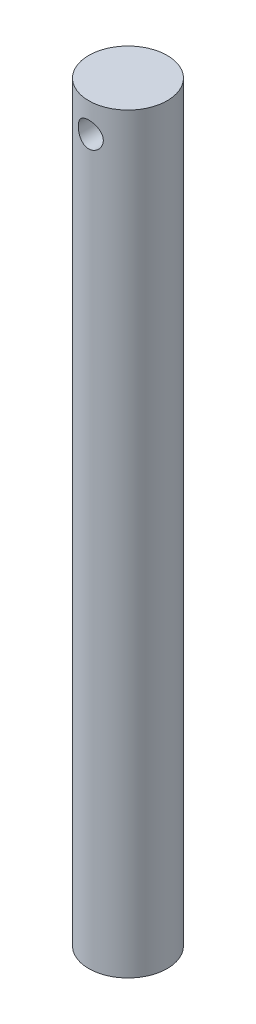
ISO-10303-21;
HEADER;
FILE_DESCRIPTION(('STEP AP214'),'2;1');
FILE_NAME('part.step','',(''),(''),'','','');
FILE_SCHEMA(('AUTOMOTIVE_DESIGN { 1 0 10303 214 1 1 1 1 }'));
ENDSEC;
DATA;
#1=APPLICATION_CONTEXT('core data for automotive mechanical design processes');
#2=APPLICATION_PROTOCOL_DEFINITION('international standard','automotive_design',2000,#1);
#3=PRODUCT_CONTEXT('',#1,'mechanical');
#4=PRODUCT('Part','Part','',(#3));
#5=PRODUCT_RELATED_PRODUCT_CATEGORY('part','',(#4));
#6=PRODUCT_DEFINITION_FORMATION('','',#4);
#7=PRODUCT_DEFINITION_CONTEXT('part definition',#1,'design');
#8=PRODUCT_DEFINITION('design','',#6,#7);
#9=PRODUCT_DEFINITION_SHAPE('','',#8);
#10=(LENGTH_UNIT() NAMED_UNIT(*) SI_UNIT(.MILLI.,.METRE.));
#11=(NAMED_UNIT(*) PLANE_ANGLE_UNIT() SI_UNIT($,.RADIAN.));
#12=(NAMED_UNIT(*) SI_UNIT($,.STERADIAN.) SOLID_ANGLE_UNIT());
#13=UNCERTAINTY_MEASURE_WITH_UNIT(LENGTH_MEASURE(1.E-05),#10,'distance_accuracy_value','');
#14=(GEOMETRIC_REPRESENTATION_CONTEXT(3) GLOBAL_UNCERTAINTY_ASSIGNED_CONTEXT((#13)) GLOBAL_UNIT_ASSIGNED_CONTEXT((#10,
#11,#12)) REPRESENTATION_CONTEXT('',''));
#15=CARTESIAN_POINT('',(0.,0.,0.));
#16=DIRECTION('',(0.,0.,1.));
#17=DIRECTION('',(1.,0.,0.));
#18=AXIS2_PLACEMENT_3D('',#15,#16,#17);
#19=CARTESIAN_POINT('',(0.,180.,0.));
#20=DIRECTION('',(0.,-1.,0.));
#21=DIRECTION('',(0.,0.,-1.));
#22=AXIS2_PLACEMENT_3D('',#19,#20,#21);
#23=CYLINDRICAL_SURFACE('',#22,9.4);
#24=CARTESIAN_POINT('',(0.,176.,-9.4));
#25=CARTESIAN_POINT('',(-0.164077470489831,175.999999470935,-9.39999954806121));
#26=CARTESIAN_POINT('',(-0.328161250908178,175.986495103096,-9.39566376836351));
#27=CARTESIAN_POINT('',(-0.651519409291409,175.932983405037,-9.37879296985486));
#28=CARTESIAN_POINT('',(-0.810792879393145,175.892971104183,-9.3662564132809));
#29=CARTESIAN_POINT('',(-1.11982123641581,175.787938081643,-9.33435130741574));
#30=CARTESIAN_POINT('',(-1.26959079188904,175.722957047876,-9.31499360439881));
#31=CARTESIAN_POINT('',(-1.5561074913261,175.570003297434,-9.2714377159008));
#32=CARTESIAN_POINT('',(-1.69285241032534,175.482026662056,-9.24723870557312));
#33=CARTESIAN_POINT('',(-1.95382349376147,175.282611489651,-9.19569409293265));
#34=CARTESIAN_POINT('',(-2.07757366671397,175.170568392752,-9.16827776632944));
#35=CARTESIAN_POINT('',(-2.3048844016925,174.927487400136,-9.11379162666395));
#36=CARTESIAN_POINT('',(-2.4084409975412,174.796445781756,-9.08672188264675));
#37=CARTESIAN_POINT('',(-2.59504820345534,174.514915563449,-9.03522898873549));
#38=CARTESIAN_POINT('',(-2.67749666606587,174.364010420405,-9.01089279091667));
#39=CARTESIAN_POINT('',(-2.8156454291163,174.04957403711,-8.96868979451483));
#40=CARTESIAN_POINT('',(-2.87135312129096,173.886046300545,-8.95082120847853));
#41=CARTESIAN_POINT('',(-2.95268350808569,173.556391414685,-8.92431789620066));
#42=CARTESIAN_POINT('',(-2.97919203574533,173.39050523012,-8.91541203755513));
#43=CARTESIAN_POINT('',(-3.00413969308351,173.056419184158,-8.90703845090929));
#44=CARTESIAN_POINT('',(-3.00258665618365,172.888219981544,-8.90756808897741));
#45=CARTESIAN_POINT('',(-2.97214652057047,172.561679857283,-8.91776686392915));
#46=CARTESIAN_POINT('',(-2.94439468902201,172.403219234192,-8.92705639169457));
#47=CARTESIAN_POINT('',(-2.86418895317406,172.09333270438,-8.95311016597804));
#48=CARTESIAN_POINT('',(-2.81173232041958,171.941907576706,-8.9698752381015));
#49=CARTESIAN_POINT('',(-2.68282284249056,171.647725321901,-9.00927557068709));
#50=CARTESIAN_POINT('',(-2.60601985578356,171.505133465873,-9.03199559079645));
#51=CARTESIAN_POINT('',(-2.43084093937358,171.23449334413,-9.08070805396861));
#52=CARTESIAN_POINT('',(-2.33245920532367,171.106449005564,-9.10670137669616));
#53=CARTESIAN_POINT('',(-2.11138169318756,170.862132377468,-9.16054536353899));
#54=CARTESIAN_POINT('',(-1.98775149936678,170.746710517761,-9.18842554343806));
#55=CARTESIAN_POINT('',(-1.72254378637404,170.538026086335,-9.24181343737215));
#56=CARTESIAN_POINT('',(-1.58096482223082,170.444765300439,-9.26732096010873));
#57=CARTESIAN_POINT('',(-1.2821881876731,170.282440689262,-9.31337751751181));
#58=CARTESIAN_POINT('',(-1.12486889739939,170.213587502037,-9.3338829331381));
#59=CARTESIAN_POINT('',(-0.800072736095409,170.103578722303,-9.3673095353702));
#60=CARTESIAN_POINT('',(-0.632599106047738,170.0624143425,-9.3802331279695));
#61=CARTESIAN_POINT('',(-0.299460884184892,170.010418427804,-9.39664920554624));
#62=CARTESIAN_POINT('',(-0.133993238208741,169.998436299098,-9.40049923314968));
#63=CARTESIAN_POINT('',(0.196610506282663,170.00189045309,-9.39939648681926));
#64=CARTESIAN_POINT('',(0.361746651678781,170.017322538365,-9.39444506048672));
#65=CARTESIAN_POINT('',(0.68250956521564,170.07424731288,-9.37653108344297));
#66=CARTESIAN_POINT('',(0.838272058507402,170.115048615775,-9.36378120906926));
#67=CARTESIAN_POINT('',(1.14069131775732,170.22070351201,-9.33177184409746));
#68=CARTESIAN_POINT('',(1.28734694292983,170.285560111606,-9.31251153989984));
#69=CARTESIAN_POINT('',(1.57147275037586,170.439293817218,-9.26885448794427));
#70=CARTESIAN_POINT('',(1.70862137180437,170.528731233799,-9.24434129984636));
#71=CARTESIAN_POINT('',(1.96634610150375,170.728420035918,-9.19297450501304));
#72=CARTESIAN_POINT('',(2.08691751685651,170.838677294561,-9.16612023903244));
#73=CARTESIAN_POINT('',(2.31325606231478,171.082288823271,-9.11169408137757));
#74=CARTESIAN_POINT('',(2.41820263968151,171.216410896706,-9.08413856796694));
#75=CARTESIAN_POINT('',(2.60418162850969,171.500959629424,-9.03258454260389));
#76=CARTESIAN_POINT('',(2.68521425910941,171.651386139282,-9.00858599805776));
#77=CARTESIAN_POINT('',(2.82059617306601,171.964069481191,-8.96712125723658));
#78=CARTESIAN_POINT('',(2.87503508785583,172.126284427551,-8.94963316622974));
#79=CARTESIAN_POINT('',(2.95561446162164,172.458255982248,-8.92334995921455));
#80=CARTESIAN_POINT('',(2.98176629350441,172.628009531069,-8.91455134969784));
#81=CARTESIAN_POINT('',(3.00418975128659,172.96163158371,-8.90701792548483));
#82=CARTESIAN_POINT('',(3.00181231867922,173.125400100078,-8.90782808627987));
#83=CARTESIAN_POINT('',(2.97052587445334,173.450079271523,-8.91830936711926));
#84=CARTESIAN_POINT('',(2.94161820228853,173.610990070461,-8.92798003981572));
#85=CARTESIAN_POINT('',(2.85901298731115,173.922856096908,-8.95476804961276));
#86=CARTESIAN_POINT('',(2.80571788418963,174.073929120955,-8.9717642465573));
#87=CARTESIAN_POINT('',(2.67617011817065,174.365108380821,-9.01125285119482));
#88=CARTESIAN_POINT('',(2.59991264458935,174.505212310825,-9.03374641041511));
#89=CARTESIAN_POINT('',(2.42298978489153,174.776630560067,-9.08283335969191));
#90=CARTESIAN_POINT('',(2.32145982977443,174.907357845687,-9.10955603895614));
#91=CARTESIAN_POINT('',(2.0983765587176,175.150356573113,-9.16351284091298));
#92=CARTESIAN_POINT('',(1.97681779421186,175.262622976237,-9.19074710098313));
#93=CARTESIAN_POINT('',(1.71207232598818,175.469408470947,-9.24378865985534));
#94=CARTESIAN_POINT('',(1.56828303317006,175.563179514515,-9.26951403521373));
#95=CARTESIAN_POINT('',(1.26616384040922,175.725101012932,-9.31558512962654));
#96=CARTESIAN_POINT('',(1.10783907006028,175.793260463237,-9.33593273674646));
#97=CARTESIAN_POINT('',(0.792926630092125,175.897718615548,-9.36773612734605));
#98=CARTESIAN_POINT('',(0.637036509380272,175.935959902683,-9.3797271674068));
#99=CARTESIAN_POINT('',(0.320765593639223,175.987098018458,-9.39585844643191));
#100=CARTESIAN_POINT('',(0.160385811410837,176.000000517161,-9.4000004417704));
#101=CARTESIAN_POINT('',(0.,176.,-9.4));
#102=B_SPLINE_CURVE_WITH_KNOTS('',3,(#24,#25,#26,#27,#28,#29,#30,#31,#32,#33,#34,#35,#36,#37,
#38,#39,#40,#41,#42,#43,#44,#45,#46,#47,#48,#49,#50,#51,#52,#53,#54,#55,#56,#57,#58,#59,#60,#61,
#62,#63,#64,#65,#66,#67,#68,#69,#70,#71,#72,#73,#74,#75,#76,#77,#78,#79,#80,#81,#82,#83,#84,#85,
#86,#87,#88,#89,#90,#91,#92,#93,#94,#95,#96,#97,#98,#99,#100,#101),.UNSPECIFIED.,.T.,.F.,(4,2,2,
2,2,2,2,2,2,2,2,2,2,2,2,2,2,2,2,2,2,2,2,2,2,2,2,2,2,2,2,2,2,2,2,2,2,2,4),(0.,0.491642670836408,
0.983377558144805,1.47433404239505,1.96537424560118,2.47060524027465,2.97593536656139,
3.49438431270147,4.01268986555103,4.51479683249523,5.01676363780371,5.49793119322769,
5.97915190236772,6.46763387747095,6.95624740810529,7.46811817910525,7.98003018461752,
8.49625820647579,9.01232232131036,9.50768387497366,10.0029695897595,10.4853155886975,
10.9677218880557,11.4621960831845,11.9568099743368,12.4719208456453,12.9870269965284,
13.5003848458665,14.0135362213303,14.5024882320929,14.9914155580974,15.4725504438551,
15.9537861989944,16.4545418343841,16.9554339191498,17.4736488247902,17.9916815494037,
18.4723700878433,18.9529510503051),.UNSPECIFIED.);
#103=CARTESIAN_POINT('',(0.,176.,-9.4));
#104=VERTEX_POINT('',#103);
#105=EDGE_CURVE('E12',#104,#104,#102,.T.);
#106=ORIENTED_EDGE('',*,*,#105,.T.);
#107=EDGE_LOOP('',(#106));
#108=FACE_BOUND('',#107,.T.);
#109=CARTESIAN_POINT('',(3.,173.,8.90842298052804));
#110=CARTESIAN_POINT('',(2.99999944551202,172.83616292116,8.90842355580121));
#111=CARTESIAN_POINT('',(2.98653319210237,172.672319522679,8.91299217302225));
#112=CARTESIAN_POINT('',(2.9331866175705,172.349458937418,8.93068786685061));
#113=CARTESIAN_POINT('',(2.89330005397961,172.190442900514,8.94381696607753));
#114=CARTESIAN_POINT('',(2.78863422533186,171.881961991662,8.97699838804047));
#115=CARTESIAN_POINT('',(2.72390047481657,171.732480235475,8.99703804538643));
#116=CARTESIAN_POINT('',(2.57153086098392,171.446454899396,9.04176476866295));
#117=CARTESIAN_POINT('',(2.48389062647002,171.309913795726,9.0664527213663));
#118=CARTESIAN_POINT('',(2.28483177661673,171.048752094704,9.11868670142876));
#119=CARTESIAN_POINT('',(2.17273274483269,170.924663352817,9.14629955266741));
#120=CARTESIAN_POINT('',(1.92939314194433,170.696688087356,9.20070464975101));
#121=CARTESIAN_POINT('',(1.79814978160329,170.592804512733,9.22749677533077));
#122=CARTESIAN_POINT('',(1.51640401733318,170.405820855767,9.27800896684672));
#123=CARTESIAN_POINT('',(1.36551899788323,170.323271484111,9.30164121130606));
#124=CARTESIAN_POINT('',(1.05112328369015,170.184930987532,9.34238839904248));
#125=CARTESIAN_POINT('',(0.887615703138742,170.129133286875,9.35950494370735));
#126=CARTESIAN_POINT('',(0.558187449971977,170.04766450911,9.38481906828492));
#127=CARTESIAN_POINT('',(0.392512772112125,170.021083749528,9.39328534301072));
#128=CARTESIAN_POINT('',(0.0588531833406413,169.995917940162,9.40129549260589));
#129=CARTESIAN_POINT('',(-0.109131171075982,169.997326260822,9.40084148035402));
#130=CARTESIAN_POINT('',(-0.436227852521742,170.027506901312,9.39124773980567));
#131=CARTESIAN_POINT('',(-0.595441888583559,170.055292494636,9.38242122135951));
#132=CARTESIAN_POINT('',(-0.906816016790057,170.135815942711,9.35746194771307));
#133=CARTESIAN_POINT('',(-1.05897564184418,170.18855544714,9.34132870947569));
#134=CARTESIAN_POINT('',(-1.35416091453656,170.318105298444,9.30315508422285));
#135=CARTESIAN_POINT('',(-1.4970480949096,170.395209200038,9.28104315860557));
#136=CARTESIAN_POINT('',(-1.76815810836419,170.571061719259,9.23323318337949));
#137=CARTESIAN_POINT('',(-1.89637709990865,170.669815987367,9.20753419822936));
#138=CARTESIAN_POINT('',(-2.14039093473823,170.891203011327,9.15396174620494));
#139=CARTESIAN_POINT('',(-2.25540566289409,171.014685693227,9.12604231098691));
#140=CARTESIAN_POINT('',(-2.46333347762658,171.279440465901,9.07213069984808));
#141=CARTESIAN_POINT('',(-2.55624372230966,171.420714840522,9.0461387720353));
#142=CARTESIAN_POINT('',(-2.71828571859886,171.719330081143,8.99878685692771));
#143=CARTESIAN_POINT('',(-2.78711606657574,171.876844707006,8.97748673793884));
#144=CARTESIAN_POINT('',(-2.89702409331116,172.202074695677,8.94262907118287));
#145=CARTESIAN_POINT('',(-2.93811225519386,172.369786179188,8.92906859908393));
#146=CARTESIAN_POINT('',(-2.98983863392866,172.703148772708,8.9118786621899));
#147=CARTESIAN_POINT('',(-3.00167617212799,172.868593724021,8.90785832681626));
#148=CARTESIAN_POINT('',(-2.99794170240944,173.199121581842,8.90911631418849));
#149=CARTESIAN_POINT('',(-2.98237415551395,173.364204542894,8.91439312353758));
#150=CARTESIAN_POINT('',(-2.92534514842051,173.68406882467,8.93326373478144));
#151=CARTESIAN_POINT('',(-2.88468996192181,173.839010793548,8.94659830711034));
#152=CARTESIAN_POINT('',(-2.77959284776365,174.139852581124,8.97980401675619));
#153=CARTESIAN_POINT('',(-2.71514693189688,174.285750878975,8.99967624996641));
#154=CARTESIAN_POINT('',(-2.56211955584604,174.569153804304,9.04444917637221));
#155=CARTESIAN_POINT('',(-2.47287905985344,174.706281235913,9.06948150707161));
#156=CARTESIAN_POINT('',(-2.27355798701656,174.964050543009,9.12148700346645));
#157=CARTESIAN_POINT('',(-2.16347176595913,175.084687938367,9.1484606935776));
#158=CARTESIAN_POINT('',(-1.91989028341433,175.31146989744,9.20272945888258));
#159=CARTESIAN_POINT('',(-1.78558498717357,175.416755652654,9.22998746572608));
#160=CARTESIAN_POINT('',(-1.50054964070287,175.603335901117,9.28058570780895));
#161=CARTESIAN_POINT('',(-1.3498202984154,175.684631427881,9.30392611180268));
#162=CARTESIAN_POINT('',(-1.0370957657006,175.820151343734,9.34393256919197));
#163=CARTESIAN_POINT('',(-0.875189665857122,175.874566744164,9.36064554466592));
#164=CARTESIAN_POINT('',(-0.543893019303663,175.95520206318,9.38571955276349));
#165=CARTESIAN_POINT('',(-0.374504944986433,175.98143122431,9.39408332310947));
#166=CARTESIAN_POINT('',(-0.040941919206546,176.004172988792,9.40132720084067));
#167=CARTESIAN_POINT('',(0.123141019697496,176.001923597182,9.40060241486101));
#168=CARTESIAN_POINT('',(0.448484156986928,175.970784721324,9.39070527402717));
#169=CARTESIAN_POINT('',(0.609744552257155,175.941897102815,9.38153351079906));
#170=CARTESIAN_POINT('',(0.922712411678374,175.85910110324,9.35590439957263));
#171=CARTESIAN_POINT('',(1.07451957825294,175.805536400785,9.33954726350454));
#172=CARTESIAN_POINT('',(1.36706115201644,175.675219344721,9.30123285831134));
#173=CARTESIAN_POINT('',(1.5077936174321,175.598462936181,9.27927460996998));
#174=CARTESIAN_POINT('',(1.77954030330891,175.420846456456,9.23108625065706));
#175=CARTESIAN_POINT('',(1.91004370967406,175.319238433266,9.20473376427968));
#176=CARTESIAN_POINT('',(2.15255670550981,175.096107292041,9.1510630826314));
#177=CARTESIAN_POINT('',(2.26456062560843,174.974578091591,9.12374459442112));
#178=CARTESIAN_POINT('',(2.47085907424239,174.7099616361,9.07009544073137));
#179=CARTESIAN_POINT('',(2.56439688931789,174.566268885931,9.04383277786961));
#180=CARTESIAN_POINT('',(2.72590485967991,174.264403723388,8.99647507480559));
#181=CARTESIAN_POINT('',(2.79388424807814,174.106236565693,8.9753781694095));
#182=CARTESIAN_POINT('',(2.89803106381982,173.791724444457,8.94226998060605));
#183=CARTESIAN_POINT('',(2.93615312569786,173.636084122078,8.92970934757434));
#184=CARTESIAN_POINT('',(2.98713439635955,173.320297046193,8.91278669198129));
#185=CARTESIAN_POINT('',(3.00000054201469,173.160151542355,8.90842241819572));
#186=CARTESIAN_POINT('',(3.,173.,8.90842298052804));
#187=B_SPLINE_CURVE_WITH_KNOTS('',3,(#109,#110,#111,#112,#113,#114,#115,#116,#117,#118,#119,
#120,#121,#122,#123,#124,#125,#126,#127,#128,#129,#130,#131,#132,#133,#134,#135,#136,#137,#138,
#139,#140,#141,#142,#143,#144,#145,#146,#147,#148,#149,#150,#151,#152,#153,#154,#155,#156,#157,
#158,#159,#160,#161,#162,#163,#164,#165,#166,#167,#168,#169,#170,#171,#172,#173,#174,#175,#176,
#177,#178,#179,#180,#181,#182,#183,#184,#185,#186),.UNSPECIFIED.,.T.,.F.,(4,2,2,2,2,2,2,2,2,2,2,
2,2,2,2,2,2,2,2,2,2,2,2,2,2,2,2,2,2,2,2,2,2,2,2,2,2,2,4),(0.,0.490919187482448,
0.981954408474039,1.47209442145138,1.96232803519994,2.46849936760804,2.97474452054382,
3.49298357867825,4.01109518490842,4.51257321533046,5.01393246599821,5.49724648283227,
5.98059245555073,6.46999958094151,6.95953458798666,7.47030292003908,7.98113688428594,
8.49815352680893,9.01497469131378,9.51022516403514,10.0053950269298,10.485424807865,
10.9655350961382,11.4598823744649,11.9543636947324,12.4703568167384,12.9863277061563,
13.4985773593797,14.0106589896101,14.5005589978373,14.9904246960894,15.4736651788821,
15.9569902023203,16.4571890511757,16.9575409082077,17.4753988122515,17.9930694573252,
18.473077212511,18.9529531087593),.UNSPECIFIED.);
#188=CARTESIAN_POINT('',(3.,173.,8.90842298052804));
#189=VERTEX_POINT('',#188);
#190=EDGE_CURVE('E61',#189,#189,#187,.T.);
#191=ORIENTED_EDGE('',*,*,#190,.T.);
#192=EDGE_LOOP('',(#191));
#193=FACE_BOUND('',#192,.T.);
#194=CARTESIAN_POINT('',(0.,180.,0.));
#195=DIRECTION('',(0.,1.,0.));
#196=DIRECTION('',(0.,0.,1.));
#197=AXIS2_PLACEMENT_3D('',#194,#195,#196);
#198=CIRCLE('',#197,9.4);
#199=CARTESIAN_POINT('',(0.,180.,9.4));
#200=VERTEX_POINT('',#199);
#201=EDGE_CURVE('E66',#200,#200,#198,.T.);
#202=ORIENTED_EDGE('',*,*,#201,.F.);
#203=EDGE_LOOP('',(#202));
#204=FACE_BOUND('',#203,.T.);
#205=CARTESIAN_POINT('',(0.,0.,0.));
#206=DIRECTION('',(0.,1.,0.));
#207=DIRECTION('',(0.,0.,1.));
#208=AXIS2_PLACEMENT_3D('',#205,#206,#207);
#209=CIRCLE('',#208,9.4);
#210=CARTESIAN_POINT('',(0.,0.,9.4));
#211=VERTEX_POINT('',#210);
#212=EDGE_CURVE('E71',#211,#211,#209,.T.);
#213=ORIENTED_EDGE('',*,*,#212,.T.);
#214=EDGE_LOOP('',(#213));
#215=FACE_BOUND('',#214,.T.);
#216=ADVANCED_FACE('F49',(#108,#193,#204,#215),#23,.T.);
#217=CARTESIAN_POINT('',(0.,180.,0.));
#218=DIRECTION('',(0.,1.,0.));
#219=DIRECTION('',(0.,0.,1.));
#220=AXIS2_PLACEMENT_3D('',#217,#218,#219);
#221=PLANE('',#220);
#222=ORIENTED_EDGE('',*,*,#201,.T.);
#223=EDGE_LOOP('',(#222));
#224=FACE_BOUND('',#223,.T.);
#225=ADVANCED_FACE('F83',(#224),#221,.T.);
#226=CARTESIAN_POINT('',(0.,0.,0.));
#227=DIRECTION('',(0.,1.,0.));
#228=DIRECTION('',(0.,0.,1.));
#229=AXIS2_PLACEMENT_3D('',#226,#227,#228);
#230=PLANE('',#229);
#231=ORIENTED_EDGE('',*,*,#212,.F.);
#232=EDGE_LOOP('',(#231));
#233=FACE_BOUND('',#232,.T.);
#234=ADVANCED_FACE('F81',(#233),#230,.F.);
#235=CARTESIAN_POINT('',(0.,173.,-9.4));
#236=DIRECTION('',(0.,0.,1.));
#237=DIRECTION('',(1.,0.,0.));
#238=AXIS2_PLACEMENT_3D('',#235,#236,#237);
#239=CYLINDRICAL_SURFACE('',#238,3.);
#240=ORIENTED_EDGE('',*,*,#190,.F.);
#241=EDGE_LOOP('',(#240));
#242=FACE_BOUND('',#241,.T.);
#243=ORIENTED_EDGE('',*,*,#105,.F.);
#244=EDGE_LOOP('',(#243));
#245=FACE_BOUND('',#244,.T.);
#246=ADVANCED_FACE('F77',(#242,#245),#239,.F.);
#247=CLOSED_SHELL('',(#216,#225,#234,#246));
#248=MANIFOLD_SOLID_BREP('B2',#247);
#249=ADVANCED_BREP_SHAPE_REPRESENTATION('',(#18,#248),#14);
#250=SHAPE_DEFINITION_REPRESENTATION(#9,#249);
ENDSEC;
END-ISO-10303-21;
